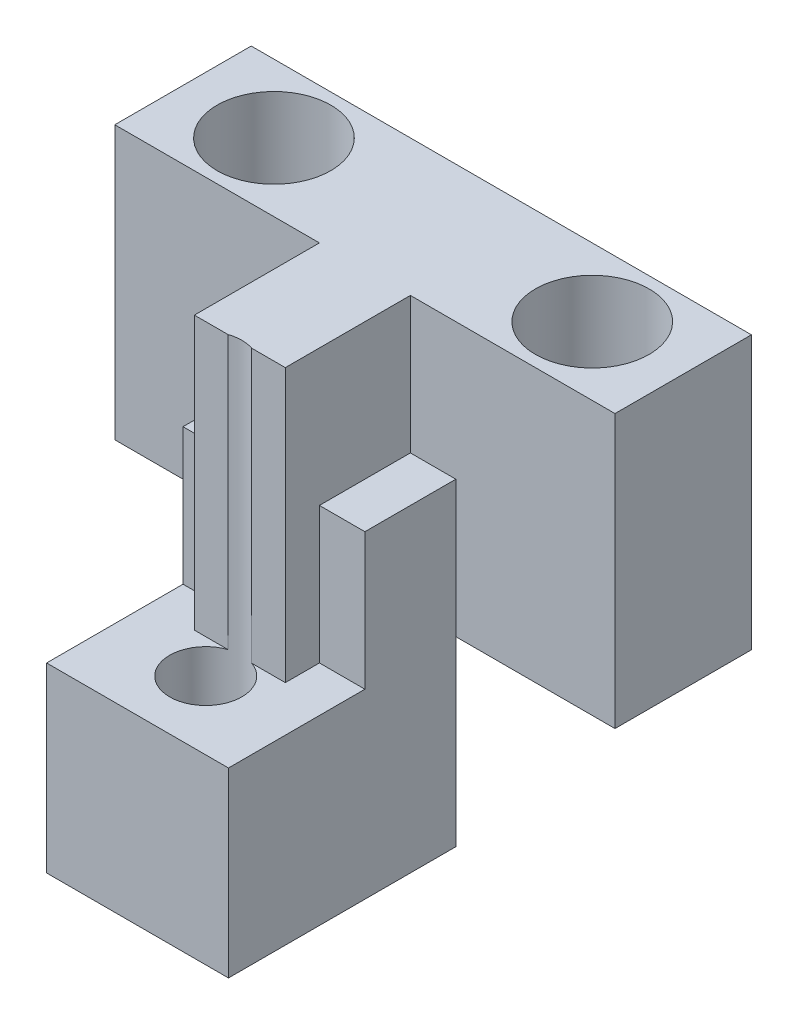
ISO-10303-21;
HEADER;
FILE_DESCRIPTION(('STEP AP214'),'2;1');
FILE_NAME('part.step','',(''),(''),'','','');
FILE_SCHEMA(('AUTOMOTIVE_DESIGN { 1 0 10303 214 1 1 1 1 }'));
ENDSEC;
DATA;
#1=APPLICATION_CONTEXT('core data for automotive mechanical design processes');
#2=APPLICATION_PROTOCOL_DEFINITION('international standard','automotive_design',2000,#1);
#3=PRODUCT_CONTEXT('',#1,'mechanical');
#4=PRODUCT('Part','Part','',(#3));
#5=PRODUCT_RELATED_PRODUCT_CATEGORY('part','',(#4));
#6=PRODUCT_DEFINITION_FORMATION('','',#4);
#7=PRODUCT_DEFINITION_CONTEXT('part definition',#1,'design');
#8=PRODUCT_DEFINITION('design','',#6,#7);
#9=PRODUCT_DEFINITION_SHAPE('','',#8);
#10=(LENGTH_UNIT() NAMED_UNIT(*) SI_UNIT(.MILLI.,.METRE.));
#11=(NAMED_UNIT(*) PLANE_ANGLE_UNIT() SI_UNIT($,.RADIAN.));
#12=(NAMED_UNIT(*) SI_UNIT($,.STERADIAN.) SOLID_ANGLE_UNIT());
#13=UNCERTAINTY_MEASURE_WITH_UNIT(LENGTH_MEASURE(1.E-05),#10,'distance_accuracy_value','');
#14=(GEOMETRIC_REPRESENTATION_CONTEXT(3) GLOBAL_UNCERTAINTY_ASSIGNED_CONTEXT((#13)) GLOBAL_UNIT_ASSIGNED_CONTEXT((#10,
#11,#12)) REPRESENTATION_CONTEXT('',''));
#15=CARTESIAN_POINT('',(0.,0.,0.));
#16=DIRECTION('',(0.,0.,1.));
#17=DIRECTION('',(1.,0.,0.));
#18=AXIS2_PLACEMENT_3D('',#15,#16,#17);
#19=CARTESIAN_POINT('',(-22.,12.,12.));
#20=DIRECTION('',(0.,-1.,0.));
#21=DIRECTION('',(0.,0.,-1.));
#22=AXIS2_PLACEMENT_3D('',#19,#20,#21);
#23=PLANE('',#22);
#24=CARTESIAN_POINT('',(14.,12.,6.));
#25=DIRECTION('',(0.,1.,0.));
#26=DIRECTION('',(0.,0.,1.));
#27=AXIS2_PLACEMENT_3D('',#24,#25,#26);
#28=CIRCLE('',#27,5.);
#29=CARTESIAN_POINT('',(14.,12.,11.));
#30=VERTEX_POINT('',#29);
#31=EDGE_CURVE('E335',#30,#30,#28,.T.);
#32=ORIENTED_EDGE('',*,*,#31,.F.);
#33=EDGE_LOOP('',(#32));
#34=FACE_BOUND('',#33,.T.);
#35=CARTESIAN_POINT('',(-14.,12.,6.));
#36=DIRECTION('',(0.,1.,0.));
#37=DIRECTION('',(0.,0.,1.));
#38=AXIS2_PLACEMENT_3D('',#35,#36,#37);
#39=CIRCLE('',#38,5.);
#40=CARTESIAN_POINT('',(-14.,12.,11.));
#41=VERTEX_POINT('',#40);
#42=EDGE_CURVE('E333',#41,#41,#39,.T.);
#43=ORIENTED_EDGE('',*,*,#42,.F.);
#44=EDGE_LOOP('',(#43));
#45=FACE_BOUND('',#44,.T.);
#46=CARTESIAN_POINT('',(0.,12.,26.));
#47=DIRECTION('',(0.,1.,0.));
#48=DIRECTION('',(0.,0.,1.));
#49=AXIS2_PLACEMENT_3D('',#46,#47,#48);
#50=CIRCLE('',#49,3.175);
#51=CARTESIAN_POINT('',(1.03953114431459,12.,23.));
#52=VERTEX_POINT('',#51);
#53=CARTESIAN_POINT('',(-1.03953114431459,12.,23.));
#54=VERTEX_POINT('',#53);
#55=EDGE_CURVE('E174',#52,#54,#50,.T.);
#56=ORIENTED_EDGE('',*,*,#55,.F.);
#57=DIRECTION('',(-1.,0.,0.));
#58=VECTOR('',#57,1.);
#59=CARTESIAN_POINT('',(-4.,12.,23.));
#60=LINE('',#59,#58);
#61=CARTESIAN_POINT('',(4.,12.,23.));
#62=VERTEX_POINT('',#61);
#63=EDGE_CURVE('E182',#62,#52,#60,.T.);
#64=ORIENTED_EDGE('',*,*,#63,.F.);
#65=DIRECTION('',(0.,0.,-1.));
#66=VECTOR('',#65,1.);
#67=CARTESIAN_POINT('',(4.,12.,23.));
#68=LINE('',#67,#66);
#69=CARTESIAN_POINT('',(4.,12.,12.));
#70=VERTEX_POINT('',#69);
#71=EDGE_CURVE('E195',#62,#70,#68,.T.);
#72=ORIENTED_EDGE('',*,*,#71,.T.);
#73=DIRECTION('',(-1.,0.,0.));
#74=VECTOR('',#73,1.);
#75=CARTESIAN_POINT('',(-22.,12.,12.));
#76=LINE('',#75,#74);
#77=CARTESIAN_POINT('',(22.,12.,12.));
#78=VERTEX_POINT('',#77);
#79=EDGE_CURVE('E225',#78,#70,#76,.T.);
#80=ORIENTED_EDGE('',*,*,#79,.F.);
#81=DIRECTION('',(0.,0.,-1.));
#82=VECTOR('',#81,1.);
#83=CARTESIAN_POINT('',(22.,12.,12.));
#84=LINE('',#83,#82);
#85=CARTESIAN_POINT('',(22.,12.,0.));
#86=VERTEX_POINT('',#85);
#87=EDGE_CURVE('E233',#78,#86,#84,.T.);
#88=ORIENTED_EDGE('',*,*,#87,.T.);
#89=DIRECTION('',(-1.,0.,0.));
#90=VECTOR('',#89,1.);
#91=CARTESIAN_POINT('',(-22.,12.,0.));
#92=LINE('',#91,#90);
#93=CARTESIAN_POINT('',(-22.,12.,0.));
#94=VERTEX_POINT('',#93);
#95=EDGE_CURVE('E214',#86,#94,#92,.T.);
#96=ORIENTED_EDGE('',*,*,#95,.T.);
#97=DIRECTION('',(0.,0.,-1.));
#98=VECTOR('',#97,1.);
#99=CARTESIAN_POINT('',(-22.,12.,12.));
#100=LINE('',#99,#98);
#101=CARTESIAN_POINT('',(-22.,12.,12.));
#102=VERTEX_POINT('',#101);
#103=EDGE_CURVE('E223',#102,#94,#100,.T.);
#104=ORIENTED_EDGE('',*,*,#103,.F.);
#105=CARTESIAN_POINT('',(-4.,12.,12.));
#106=VERTEX_POINT('',#105);
#107=EDGE_CURVE('E222',#106,#102,#76,.T.);
#108=ORIENTED_EDGE('',*,*,#107,.F.);
#109=DIRECTION('',(0.,0.,-1.));
#110=VECTOR('',#109,1.);
#111=CARTESIAN_POINT('',(-4.,12.,23.));
#112=LINE('',#111,#110);
#113=CARTESIAN_POINT('',(-4.,12.,23.));
#114=VERTEX_POINT('',#113);
#115=EDGE_CURVE('E188',#114,#106,#112,.T.);
#116=ORIENTED_EDGE('',*,*,#115,.F.);
#117=EDGE_CURVE('E181',#54,#114,#60,.T.);
#118=ORIENTED_EDGE('',*,*,#117,.F.);
#119=EDGE_LOOP('',(#56,#64,#72,#80,#88,#96,#104,#108,#116,#118));
#120=FACE_BOUND('',#119,.T.);
#121=ADVANCED_FACE('F39',(#34,#45,#120),#23,.F.);
#122=CARTESIAN_POINT('',(0.,0.,23.));
#123=DIRECTION('',(0.,0.,-1.));
#124=DIRECTION('',(-1.,0.,0.));
#125=AXIS2_PLACEMENT_3D('',#122,#123,#124);
#126=PLANE('',#125);
#127=DIRECTION('',(1.,0.,0.));
#128=VECTOR('',#127,1.);
#129=CARTESIAN_POINT('',(-4.,-12.,23.));
#130=LINE('',#129,#128);
#131=CARTESIAN_POINT('',(-4.,-12.,23.));
#132=VERTEX_POINT('',#131);
#133=CARTESIAN_POINT('',(-1.03953114431459,-12.,23.));
#134=VERTEX_POINT('',#133);
#135=EDGE_CURVE('E296',#132,#134,#130,.T.);
#136=ORIENTED_EDGE('',*,*,#135,.T.);
#137=DIRECTION('',(0.,1.,0.));
#138=VECTOR('',#137,1.);
#139=CARTESIAN_POINT('',(-1.03953114431459,-28.,23.));
#140=LINE('',#139,#138);
#141=EDGE_CURVE('E53',#134,#54,#140,.T.);
#142=ORIENTED_EDGE('',*,*,#141,.T.);
#143=ORIENTED_EDGE('',*,*,#117,.T.);
#144=DIRECTION('',(0.,-1.,0.));
#145=VECTOR('',#144,1.);
#146=CARTESIAN_POINT('',(-4.,-12.,23.));
#147=LINE('',#146,#145);
#148=EDGE_CURVE('E205',#114,#132,#147,.T.);
#149=ORIENTED_EDGE('',*,*,#148,.T.);
#150=EDGE_LOOP('',(#136,#142,#143,#149));
#151=FACE_BOUND('',#150,.T.);
#152=ADVANCED_FACE('F332',(#151),#126,.F.);
#153=CARTESIAN_POINT('',(0.,0.,20.));
#154=DIRECTION('',(0.,0.,-1.));
#155=DIRECTION('',(-1.,0.,0.));
#156=AXIS2_PLACEMENT_3D('',#153,#154,#155);
#157=PLANE('',#156);
#158=DIRECTION('',(-1.,0.,0.));
#159=VECTOR('',#158,1.);
#160=CARTESIAN_POINT('',(-8.,-12.,20.));
#161=LINE('',#160,#159);
#162=CARTESIAN_POINT('',(8.,-12.,20.));
#163=VERTEX_POINT('',#162);
#164=CARTESIAN_POINT('',(4.,-12.,20.));
#165=VERTEX_POINT('',#164);
#166=EDGE_CURVE('E304',#163,#165,#161,.T.);
#167=ORIENTED_EDGE('',*,*,#166,.F.);
#168=DIRECTION('',(0.,1.,0.));
#169=VECTOR('',#168,1.);
#170=CARTESIAN_POINT('',(8.,-28.,20.));
#171=LINE('',#170,#169);
#172=CARTESIAN_POINT('',(8.,0.,20.));
#173=VERTEX_POINT('',#172);
#174=EDGE_CURVE('E261',#163,#173,#171,.T.);
#175=ORIENTED_EDGE('',*,*,#174,.T.);
#176=DIRECTION('',(-1.,0.,0.));
#177=VECTOR('',#176,1.);
#178=CARTESIAN_POINT('',(-8.,0.,20.));
#179=LINE('',#178,#177);
#180=CARTESIAN_POINT('',(4.,0.,20.));
#181=VERTEX_POINT('',#180);
#182=EDGE_CURVE('E251',#173,#181,#179,.T.);
#183=ORIENTED_EDGE('',*,*,#182,.T.);
#184=DIRECTION('',(0.,-1.,0.));
#185=VECTOR('',#184,1.);
#186=CARTESIAN_POINT('',(4.,-12.,20.));
#187=LINE('',#186,#185);
#188=EDGE_CURVE('E243',#181,#165,#187,.T.);
#189=ORIENTED_EDGE('',*,*,#188,.T.);
#190=EDGE_LOOP('',(#167,#175,#183,#189));
#191=FACE_BOUND('',#190,.T.);
#192=ADVANCED_FACE('F259',(#191),#157,.F.);
#193=CARTESIAN_POINT('',(-4.,-12.,20.));
#194=VERTEX_POINT('',#193);
#195=CARTESIAN_POINT('',(-8.,-12.,20.));
#196=VERTEX_POINT('',#195);
#197=EDGE_CURVE('E350',#194,#196,#161,.T.);
#198=ORIENTED_EDGE('',*,*,#197,.F.);
#199=DIRECTION('',(0.,1.,0.));
#200=VECTOR('',#199,1.);
#201=CARTESIAN_POINT('',(-4.,-12.,20.));
#202=LINE('',#201,#200);
#203=CARTESIAN_POINT('',(-4.,0.,20.));
#204=VERTEX_POINT('',#203);
#205=EDGE_CURVE('E288',#194,#204,#202,.T.);
#206=ORIENTED_EDGE('',*,*,#205,.T.);
#207=CARTESIAN_POINT('',(-8.,0.,20.));
#208=VERTEX_POINT('',#207);
#209=EDGE_CURVE('E262',#204,#208,#179,.T.);
#210=ORIENTED_EDGE('',*,*,#209,.T.);
#211=DIRECTION('',(0.,-1.,0.));
#212=VECTOR('',#211,1.);
#213=CARTESIAN_POINT('',(-8.,-28.,20.));
#214=LINE('',#213,#212);
#215=EDGE_CURVE('E284',#208,#196,#214,.T.);
#216=ORIENTED_EDGE('',*,*,#215,.T.);
#217=EDGE_LOOP('',(#198,#206,#210,#216));
#218=FACE_BOUND('',#217,.T.);
#219=ADVANCED_FACE('F370',(#218),#157,.F.);
#220=CARTESIAN_POINT('',(0.,0.,12.));
#221=DIRECTION('',(0.,0.,-1.));
#222=DIRECTION('',(-1.,0.,0.));
#223=AXIS2_PLACEMENT_3D('',#220,#221,#222);
#224=PLANE('',#223);
#225=DIRECTION('',(0.,-1.,0.));
#226=VECTOR('',#225,1.);
#227=CARTESIAN_POINT('',(-8.,-28.,12.));
#228=LINE('',#227,#226);
#229=CARTESIAN_POINT('',(-8.,0.,12.));
#230=VERTEX_POINT('',#229);
#231=CARTESIAN_POINT('',(-8.,-12.,12.));
#232=VERTEX_POINT('',#231);
#233=EDGE_CURVE('E64',#230,#232,#228,.T.);
#234=ORIENTED_EDGE('',*,*,#233,.F.);
#235=DIRECTION('',(-1.,0.,0.));
#236=VECTOR('',#235,1.);
#237=CARTESIAN_POINT('',(-8.,0.,12.));
#238=LINE('',#237,#236);
#239=CARTESIAN_POINT('',(-4.,0.,12.));
#240=VERTEX_POINT('',#239);
#241=EDGE_CURVE('E278',#240,#230,#238,.T.);
#242=ORIENTED_EDGE('',*,*,#241,.F.);
#243=DIRECTION('',(0.,-1.,0.));
#244=VECTOR('',#243,1.);
#245=CARTESIAN_POINT('',(-4.,-12.,12.));
#246=LINE('',#245,#244);
#247=EDGE_CURVE('E197',#106,#240,#246,.T.);
#248=ORIENTED_EDGE('',*,*,#247,.F.);
#249=ORIENTED_EDGE('',*,*,#107,.T.);
#250=DIRECTION('',(0.,-1.,0.));
#251=VECTOR('',#250,1.);
#252=CARTESIAN_POINT('',(-22.,-12.,12.));
#253=LINE('',#252,#251);
#254=CARTESIAN_POINT('',(-22.,-12.,12.));
#255=VERTEX_POINT('',#254);
#256=EDGE_CURVE('E211',#102,#255,#253,.T.);
#257=ORIENTED_EDGE('',*,*,#256,.T.);
#258=DIRECTION('',(1.,0.,0.));
#259=VECTOR('',#258,1.);
#260=CARTESIAN_POINT('',(-22.,-12.,12.));
#261=LINE('',#260,#259);
#262=EDGE_CURVE('E216',#255,#232,#261,.T.);
#263=ORIENTED_EDGE('',*,*,#262,.T.);
#264=EDGE_LOOP('',(#234,#242,#248,#249,#257,#263));
#265=FACE_BOUND('',#264,.T.);
#266=ADVANCED_FACE('F322',(#265),#224,.F.);
#267=CARTESIAN_POINT('',(8.,0.,12.));
#268=VERTEX_POINT('',#267);
#269=CARTESIAN_POINT('',(4.,0.,12.));
#270=VERTEX_POINT('',#269);
#271=EDGE_CURVE('E255',#268,#270,#238,.T.);
#272=ORIENTED_EDGE('',*,*,#271,.F.);
#273=DIRECTION('',(0.,1.,0.));
#274=VECTOR('',#273,1.);
#275=CARTESIAN_POINT('',(8.,-28.,12.));
#276=LINE('',#275,#274);
#277=CARTESIAN_POINT('',(8.,-12.,12.));
#278=VERTEX_POINT('',#277);
#279=EDGE_CURVE('E277',#278,#268,#276,.T.);
#280=ORIENTED_EDGE('',*,*,#279,.F.);
#281=CARTESIAN_POINT('',(22.,-12.,12.));
#282=VERTEX_POINT('',#281);
#283=EDGE_CURVE('E212',#278,#282,#261,.T.);
#284=ORIENTED_EDGE('',*,*,#283,.T.);
#285=DIRECTION('',(0.,1.,0.));
#286=VECTOR('',#285,1.);
#287=CARTESIAN_POINT('',(22.,-12.,12.));
#288=LINE('',#287,#286);
#289=EDGE_CURVE('E217',#282,#78,#288,.T.);
#290=ORIENTED_EDGE('',*,*,#289,.T.);
#291=ORIENTED_EDGE('',*,*,#79,.T.);
#292=DIRECTION('',(0.,1.,0.));
#293=VECTOR('',#292,1.);
#294=CARTESIAN_POINT('',(4.,-12.,12.));
#295=LINE('',#294,#293);
#296=EDGE_CURVE('E199',#270,#70,#295,.T.);
#297=ORIENTED_EDGE('',*,*,#296,.F.);
#298=EDGE_LOOP('',(#272,#280,#284,#290,#291,#297));
#299=FACE_BOUND('',#298,.T.);
#300=ADVANCED_FACE('F310',(#299),#224,.F.);
#301=CARTESIAN_POINT('',(-4.,-12.,23.));
#302=DIRECTION('',(1.,0.,0.));
#303=DIRECTION('',(0.,0.,-1.));
#304=AXIS2_PLACEMENT_3D('',#301,#302,#303);
#305=PLANE('',#304);
#306=DIRECTION('',(0.,0.,-1.));
#307=VECTOR('',#306,1.);
#308=CARTESIAN_POINT('',(-4.,0.,23.));
#309=LINE('',#308,#307);
#310=EDGE_CURVE('E203',#204,#240,#309,.T.);
#311=ORIENTED_EDGE('',*,*,#310,.F.);
#312=ORIENTED_EDGE('',*,*,#205,.F.);
#313=DIRECTION('',(0.,0.,-1.));
#314=VECTOR('',#313,1.);
#315=CARTESIAN_POINT('',(-4.,-12.,23.));
#316=LINE('',#315,#314);
#317=EDGE_CURVE('E208',#132,#194,#316,.T.);
#318=ORIENTED_EDGE('',*,*,#317,.F.);
#319=ORIENTED_EDGE('',*,*,#148,.F.);
#320=ORIENTED_EDGE('',*,*,#115,.T.);
#321=ORIENTED_EDGE('',*,*,#247,.T.);
#322=EDGE_LOOP('',(#311,#312,#318,#319,#320,#321));
#323=FACE_BOUND('',#322,.T.);
#324=ADVANCED_FACE('F327',(#323),#305,.F.);
#325=CARTESIAN_POINT('',(4.,-12.,23.));
#326=DIRECTION('',(-1.,0.,0.));
#327=DIRECTION('',(0.,0.,1.));
#328=AXIS2_PLACEMENT_3D('',#325,#326,#327);
#329=PLANE('',#328);
#330=DIRECTION('',(0.,0.,1.));
#331=VECTOR('',#330,1.);
#332=CARTESIAN_POINT('',(4.,0.,23.));
#333=LINE('',#332,#331);
#334=EDGE_CURVE('E50',#270,#181,#333,.T.);
#335=ORIENTED_EDGE('',*,*,#334,.F.);
#336=ORIENTED_EDGE('',*,*,#296,.T.);
#337=ORIENTED_EDGE('',*,*,#71,.F.);
#338=DIRECTION('',(0.,1.,0.));
#339=VECTOR('',#338,1.);
#340=CARTESIAN_POINT('',(4.,-12.,23.));
#341=LINE('',#340,#339);
#342=CARTESIAN_POINT('',(4.,-12.,23.));
#343=VERTEX_POINT('',#342);
#344=EDGE_CURVE('E186',#343,#62,#341,.T.);
#345=ORIENTED_EDGE('',*,*,#344,.F.);
#346=DIRECTION('',(0.,0.,-1.));
#347=VECTOR('',#346,1.);
#348=CARTESIAN_POINT('',(4.,-12.,23.));
#349=LINE('',#348,#347);
#350=EDGE_CURVE('E202',#343,#165,#349,.T.);
#351=ORIENTED_EDGE('',*,*,#350,.T.);
#352=ORIENTED_EDGE('',*,*,#188,.F.);
#353=EDGE_LOOP('',(#335,#336,#337,#345,#351,#352));
#354=FACE_BOUND('',#353,.T.);
#355=ADVANCED_FACE('F301',(#354),#329,.F.);
#356=CARTESIAN_POINT('',(-22.,-12.,12.));
#357=DIRECTION('',(1.,0.,0.));
#358=DIRECTION('',(0.,0.,-1.));
#359=AXIS2_PLACEMENT_3D('',#356,#357,#358);
#360=PLANE('',#359);
#361=DIRECTION('',(0.,-1.,0.));
#362=VECTOR('',#361,1.);
#363=CARTESIAN_POINT('',(-22.,-12.,0.));
#364=LINE('',#363,#362);
#365=CARTESIAN_POINT('',(-22.,-12.,0.));
#366=VERTEX_POINT('',#365);
#367=EDGE_CURVE('E209',#94,#366,#364,.T.);
#368=ORIENTED_EDGE('',*,*,#367,.T.);
#369=DIRECTION('',(0.,0.,-1.));
#370=VECTOR('',#369,1.);
#371=CARTESIAN_POINT('',(-22.,-12.,12.));
#372=LINE('',#371,#370);
#373=EDGE_CURVE('E244',#255,#366,#372,.T.);
#374=ORIENTED_EDGE('',*,*,#373,.F.);
#375=ORIENTED_EDGE('',*,*,#256,.F.);
#376=ORIENTED_EDGE('',*,*,#103,.T.);
#377=EDGE_LOOP('',(#368,#374,#375,#376));
#378=FACE_BOUND('',#377,.T.);
#379=ADVANCED_FACE('F41',(#378),#360,.F.);
#380=CARTESIAN_POINT('',(-22.,-12.,12.));
#381=DIRECTION('',(0.,1.,0.));
#382=DIRECTION('',(0.,0.,1.));
#383=AXIS2_PLACEMENT_3D('',#380,#381,#382);
#384=PLANE('',#383);
#385=CARTESIAN_POINT('',(-14.,-12.,6.));
#386=DIRECTION('',(0.,1.,0.));
#387=DIRECTION('',(0.,0.,1.));
#388=AXIS2_PLACEMENT_3D('',#385,#386,#387);
#389=CIRCLE('',#388,5.);
#390=CARTESIAN_POINT('',(-14.,-12.,11.));
#391=VERTEX_POINT('',#390);
#392=EDGE_CURVE('E341',#391,#391,#389,.T.);
#393=ORIENTED_EDGE('',*,*,#392,.T.);
#394=EDGE_LOOP('',(#393));
#395=FACE_BOUND('',#394,.T.);
#396=CARTESIAN_POINT('',(14.,-12.,6.));
#397=DIRECTION('',(0.,1.,0.));
#398=DIRECTION('',(0.,0.,1.));
#399=AXIS2_PLACEMENT_3D('',#396,#397,#398);
#400=CIRCLE('',#399,5.);
#401=CARTESIAN_POINT('',(14.,-12.,11.));
#402=VERTEX_POINT('',#401);
#403=EDGE_CURVE('E337',#402,#402,#400,.T.);
#404=ORIENTED_EDGE('',*,*,#403,.T.);
#405=EDGE_LOOP('',(#404));
#406=FACE_BOUND('',#405,.T.);
#407=EDGE_CURVE('E218',#232,#278,#261,.T.);
#408=ORIENTED_EDGE('',*,*,#407,.F.);
#409=ORIENTED_EDGE('',*,*,#262,.F.);
#410=ORIENTED_EDGE('',*,*,#373,.T.);
#411=DIRECTION('',(1.,0.,0.));
#412=VECTOR('',#411,1.);
#413=CARTESIAN_POINT('',(-22.,-12.,0.));
#414=LINE('',#413,#412);
#415=CARTESIAN_POINT('',(22.,-12.,0.));
#416=VERTEX_POINT('',#415);
#417=EDGE_CURVE('E230',#366,#416,#414,.T.);
#418=ORIENTED_EDGE('',*,*,#417,.T.);
#419=DIRECTION('',(0.,0.,-1.));
#420=VECTOR('',#419,1.);
#421=CARTESIAN_POINT('',(22.,-12.,12.));
#422=LINE('',#421,#420);
#423=EDGE_CURVE('E236',#282,#416,#422,.T.);
#424=ORIENTED_EDGE('',*,*,#423,.F.);
#425=ORIENTED_EDGE('',*,*,#283,.F.);
#426=EDGE_LOOP('',(#408,#409,#410,#418,#424,#425));
#427=FACE_BOUND('',#426,.T.);
#428=ADVANCED_FACE('F387',(#395,#406,#427),#384,.F.);
#429=CARTESIAN_POINT('',(22.,-12.,12.));
#430=DIRECTION('',(-1.,0.,0.));
#431=DIRECTION('',(0.,0.,1.));
#432=AXIS2_PLACEMENT_3D('',#429,#430,#431);
#433=PLANE('',#432);
#434=DIRECTION('',(0.,1.,0.));
#435=VECTOR('',#434,1.);
#436=CARTESIAN_POINT('',(22.,-12.,0.));
#437=LINE('',#436,#435);
#438=EDGE_CURVE('E227',#416,#86,#437,.T.);
#439=ORIENTED_EDGE('',*,*,#438,.T.);
#440=ORIENTED_EDGE('',*,*,#87,.F.);
#441=ORIENTED_EDGE('',*,*,#289,.F.);
#442=ORIENTED_EDGE('',*,*,#423,.T.);
#443=EDGE_LOOP('',(#439,#440,#441,#442));
#444=FACE_BOUND('',#443,.T.);
#445=ADVANCED_FACE('F314',(#444),#433,.F.);
#446=CARTESIAN_POINT('',(0.,0.,0.));
#447=DIRECTION('',(0.,0.,-1.));
#448=DIRECTION('',(-1.,0.,0.));
#449=AXIS2_PLACEMENT_3D('',#446,#447,#448);
#450=PLANE('',#449);
#451=ORIENTED_EDGE('',*,*,#367,.F.);
#452=ORIENTED_EDGE('',*,*,#95,.F.);
#453=ORIENTED_EDGE('',*,*,#438,.F.);
#454=ORIENTED_EDGE('',*,*,#417,.F.);
#455=EDGE_LOOP('',(#451,#452,#453,#454));
#456=FACE_BOUND('',#455,.T.);
#457=ADVANCED_FACE('F318',(#456),#450,.T.);
#458=ORIENTED_EDGE('',*,*,#63,.T.);
#459=DIRECTION('',(0.,1.,0.));
#460=VECTOR('',#459,1.);
#461=CARTESIAN_POINT('',(1.03953114431459,-28.,23.));
#462=LINE('',#461,#460);
#463=CARTESIAN_POINT('',(1.03953114431459,-12.,23.));
#464=VERTEX_POINT('',#463);
#465=EDGE_CURVE('E169',#52,#464,#462,.F.);
#466=ORIENTED_EDGE('',*,*,#465,.T.);
#467=EDGE_CURVE('E299',#464,#343,#130,.T.);
#468=ORIENTED_EDGE('',*,*,#467,.T.);
#469=ORIENTED_EDGE('',*,*,#344,.T.);
#470=EDGE_LOOP('',(#458,#466,#468,#469));
#471=FACE_BOUND('',#470,.T.);
#472=ADVANCED_FACE('F183',(#471),#126,.F.);
#473=CARTESIAN_POINT('',(0.,0.,12.));
#474=DIRECTION('',(0.,0.,-1.));
#475=DIRECTION('',(-1.,0.,0.));
#476=AXIS2_PLACEMENT_3D('',#473,#474,#475);
#477=PLANE('',#476);
#478=ORIENTED_EDGE('',*,*,#407,.T.);
#479=CARTESIAN_POINT('',(8.,-28.,12.));
#480=VERTEX_POINT('',#479);
#481=EDGE_CURVE('E280',#480,#278,#276,.T.);
#482=ORIENTED_EDGE('',*,*,#481,.F.);
#483=DIRECTION('',(1.,0.,0.));
#484=VECTOR('',#483,1.);
#485=CARTESIAN_POINT('',(-8.,-28.,12.));
#486=LINE('',#485,#484);
#487=CARTESIAN_POINT('',(-8.,-28.,12.));
#488=VERTEX_POINT('',#487);
#489=EDGE_CURVE('E272',#488,#480,#486,.T.);
#490=ORIENTED_EDGE('',*,*,#489,.F.);
#491=EDGE_CURVE('E273',#232,#488,#228,.T.);
#492=ORIENTED_EDGE('',*,*,#491,.F.);
#493=EDGE_LOOP('',(#478,#482,#490,#492));
#494=FACE_BOUND('',#493,.T.);
#495=ADVANCED_FACE('F389',(#494),#477,.T.);
#496=CARTESIAN_POINT('',(-8.,0.,20.));
#497=DIRECTION('',(0.,-1.,0.));
#498=DIRECTION('',(0.,0.,-1.));
#499=AXIS2_PLACEMENT_3D('',#496,#497,#498);
#500=PLANE('',#499);
#501=ORIENTED_EDGE('',*,*,#209,.F.);
#502=ORIENTED_EDGE('',*,*,#310,.T.);
#503=ORIENTED_EDGE('',*,*,#241,.T.);
#504=DIRECTION('',(0.,0.,-1.));
#505=VECTOR('',#504,1.);
#506=CARTESIAN_POINT('',(-8.,0.,20.));
#507=LINE('',#506,#505);
#508=EDGE_CURVE('E263',#208,#230,#507,.T.);
#509=ORIENTED_EDGE('',*,*,#508,.F.);
#510=EDGE_LOOP('',(#501,#502,#503,#509));
#511=FACE_BOUND('',#510,.T.);
#512=ADVANCED_FACE('F443',(#511),#500,.F.);
#513=ORIENTED_EDGE('',*,*,#271,.T.);
#514=ORIENTED_EDGE('',*,*,#334,.T.);
#515=ORIENTED_EDGE('',*,*,#182,.F.);
#516=DIRECTION('',(0.,0.,-1.));
#517=VECTOR('',#516,1.);
#518=CARTESIAN_POINT('',(8.,0.,20.));
#519=LINE('',#518,#517);
#520=EDGE_CURVE('E270',#173,#268,#519,.T.);
#521=ORIENTED_EDGE('',*,*,#520,.T.);
#522=EDGE_LOOP('',(#513,#514,#515,#521));
#523=FACE_BOUND('',#522,.T.);
#524=ADVANCED_FACE('F253',(#523),#500,.F.);
#525=CARTESIAN_POINT('',(-8.,-28.,20.));
#526=DIRECTION('',(1.,0.,0.));
#527=DIRECTION('',(0.,0.,-1.));
#528=AXIS2_PLACEMENT_3D('',#525,#526,#527);
#529=PLANE('',#528);
#530=ORIENTED_EDGE('',*,*,#233,.T.);
#531=ORIENTED_EDGE('',*,*,#491,.T.);
#532=DIRECTION('',(0.,0.,-1.));
#533=VECTOR('',#532,1.);
#534=CARTESIAN_POINT('',(-8.,-28.,20.));
#535=LINE('',#534,#533);
#536=CARTESIAN_POINT('',(-8.,-28.,32.));
#537=VERTEX_POINT('',#536);
#538=EDGE_CURVE('E290',#537,#488,#535,.T.);
#539=ORIENTED_EDGE('',*,*,#538,.F.);
#540=DIRECTION('',(0.,-1.,0.));
#541=VECTOR('',#540,1.);
#542=CARTESIAN_POINT('',(-8.,-28.,32.));
#543=LINE('',#542,#541);
#544=CARTESIAN_POINT('',(-8.,-12.,32.));
#545=VERTEX_POINT('',#544);
#546=EDGE_CURVE('E346',#545,#537,#543,.T.);
#547=ORIENTED_EDGE('',*,*,#546,.F.);
#548=DIRECTION('',(0.,0.,-1.));
#549=VECTOR('',#548,1.);
#550=CARTESIAN_POINT('',(-8.,-12.,32.));
#551=LINE('',#550,#549);
#552=EDGE_CURVE('E359',#545,#196,#551,.T.);
#553=ORIENTED_EDGE('',*,*,#552,.T.);
#554=ORIENTED_EDGE('',*,*,#215,.F.);
#555=ORIENTED_EDGE('',*,*,#508,.T.);
#556=EDGE_LOOP('',(#530,#531,#539,#547,#553,#554,#555));
#557=FACE_BOUND('',#556,.T.);
#558=ADVANCED_FACE('F371',(#557),#529,.F.);
#559=CARTESIAN_POINT('',(-8.,-28.,20.));
#560=DIRECTION('',(0.,1.,0.));
#561=DIRECTION('',(0.,0.,1.));
#562=AXIS2_PLACEMENT_3D('',#559,#560,#561);
#563=PLANE('',#562);
#564=CARTESIAN_POINT('',(0.,-28.,26.));
#565=DIRECTION('',(0.,1.,0.));
#566=DIRECTION('',(0.,0.,1.));
#567=AXIS2_PLACEMENT_3D('',#564,#565,#566);
#568=CIRCLE('',#567,3.175);
#569=CARTESIAN_POINT('',(0.,-28.,29.175));
#570=VERTEX_POINT('',#569);
#571=EDGE_CURVE('E172',#570,#570,#568,.T.);
#572=ORIENTED_EDGE('',*,*,#571,.T.);
#573=EDGE_LOOP('',(#572));
#574=FACE_BOUND('',#573,.T.);
#575=ORIENTED_EDGE('',*,*,#489,.T.);
#576=DIRECTION('',(0.,0.,-1.));
#577=VECTOR('',#576,1.);
#578=CARTESIAN_POINT('',(8.,-28.,20.));
#579=LINE('',#578,#577);
#580=CARTESIAN_POINT('',(8.,-28.,32.));
#581=VERTEX_POINT('',#580);
#582=EDGE_CURVE('E283',#581,#480,#579,.T.);
#583=ORIENTED_EDGE('',*,*,#582,.F.);
#584=DIRECTION('',(1.,0.,0.));
#585=VECTOR('',#584,1.);
#586=CARTESIAN_POINT('',(-8.,-28.,32.));
#587=LINE('',#586,#585);
#588=EDGE_CURVE('E354',#537,#581,#587,.T.);
#589=ORIENTED_EDGE('',*,*,#588,.F.);
#590=ORIENTED_EDGE('',*,*,#538,.T.);
#591=EDGE_LOOP('',(#575,#583,#589,#590));
#592=FACE_BOUND('',#591,.T.);
#593=ADVANCED_FACE('F394',(#574,#592),#563,.F.);
#594=CARTESIAN_POINT('',(8.,-28.,20.));
#595=DIRECTION('',(-1.,0.,0.));
#596=DIRECTION('',(0.,0.,1.));
#597=AXIS2_PLACEMENT_3D('',#594,#595,#596);
#598=PLANE('',#597);
#599=ORIENTED_EDGE('',*,*,#481,.T.);
#600=ORIENTED_EDGE('',*,*,#279,.T.);
#601=ORIENTED_EDGE('',*,*,#520,.F.);
#602=ORIENTED_EDGE('',*,*,#174,.F.);
#603=DIRECTION('',(0.,0.,-1.));
#604=VECTOR('',#603,1.);
#605=CARTESIAN_POINT('',(8.,-12.,32.));
#606=LINE('',#605,#604);
#607=CARTESIAN_POINT('',(8.,-12.,32.));
#608=VERTEX_POINT('',#607);
#609=EDGE_CURVE('E362',#608,#163,#606,.T.);
#610=ORIENTED_EDGE('',*,*,#609,.F.);
#611=DIRECTION('',(0.,1.,0.));
#612=VECTOR('',#611,1.);
#613=CARTESIAN_POINT('',(8.,-28.,32.));
#614=LINE('',#613,#612);
#615=EDGE_CURVE('E353',#581,#608,#614,.T.);
#616=ORIENTED_EDGE('',*,*,#615,.F.);
#617=ORIENTED_EDGE('',*,*,#582,.T.);
#618=EDGE_LOOP('',(#599,#600,#601,#602,#610,#616,#617));
#619=FACE_BOUND('',#618,.T.);
#620=ADVANCED_FACE('F381',(#619),#598,.F.);
#621=CARTESIAN_POINT('',(-8.,-12.,32.));
#622=DIRECTION('',(0.,-1.,0.));
#623=DIRECTION('',(0.,0.,-1.));
#624=AXIS2_PLACEMENT_3D('',#621,#622,#623);
#625=PLANE('',#624);
#626=ORIENTED_EDGE('',*,*,#467,.F.);
#627=CARTESIAN_POINT('',(0.,-12.,26.));
#628=DIRECTION('',(0.,-1.,0.));
#629=DIRECTION('',(0.,0.,-1.));
#630=AXIS2_PLACEMENT_3D('',#627,#628,#629);
#631=CIRCLE('',#630,3.175);
#632=EDGE_CURVE('E11',#464,#134,#631,.T.);
#633=ORIENTED_EDGE('',*,*,#632,.T.);
#634=ORIENTED_EDGE('',*,*,#135,.F.);
#635=ORIENTED_EDGE('',*,*,#317,.T.);
#636=ORIENTED_EDGE('',*,*,#197,.T.);
#637=ORIENTED_EDGE('',*,*,#552,.F.);
#638=DIRECTION('',(-1.,0.,0.));
#639=VECTOR('',#638,1.);
#640=CARTESIAN_POINT('',(-8.,-12.,32.));
#641=LINE('',#640,#639);
#642=EDGE_CURVE('E357',#608,#545,#641,.T.);
#643=ORIENTED_EDGE('',*,*,#642,.F.);
#644=ORIENTED_EDGE('',*,*,#609,.T.);
#645=ORIENTED_EDGE('',*,*,#166,.T.);
#646=ORIENTED_EDGE('',*,*,#350,.F.);
#647=EDGE_LOOP('',(#626,#633,#634,#635,#636,#637,#643,#644,#645,#646));
#648=FACE_BOUND('',#647,.T.);
#649=ADVANCED_FACE('F305',(#648),#625,.F.);
#650=CARTESIAN_POINT('',(0.,0.,32.));
#651=DIRECTION('',(0.,0.,-1.));
#652=DIRECTION('',(-1.,0.,0.));
#653=AXIS2_PLACEMENT_3D('',#650,#651,#652);
#654=PLANE('',#653);
#655=ORIENTED_EDGE('',*,*,#546,.T.);
#656=ORIENTED_EDGE('',*,*,#588,.T.);
#657=ORIENTED_EDGE('',*,*,#615,.T.);
#658=ORIENTED_EDGE('',*,*,#642,.T.);
#659=EDGE_LOOP('',(#655,#656,#657,#658));
#660=FACE_BOUND('',#659,.T.);
#661=ADVANCED_FACE('F380',(#660),#654,.F.);
#662=CARTESIAN_POINT('',(14.,-28.,6.));
#663=DIRECTION('',(0.,1.,0.));
#664=DIRECTION('',(0.,0.,1.));
#665=AXIS2_PLACEMENT_3D('',#662,#663,#664);
#666=CYLINDRICAL_SURFACE('',#665,5.);
#667=ORIENTED_EDGE('',*,*,#31,.T.);
#668=EDGE_LOOP('',(#667));
#669=FACE_BOUND('',#668,.T.);
#670=ORIENTED_EDGE('',*,*,#403,.F.);
#671=EDGE_LOOP('',(#670));
#672=FACE_BOUND('',#671,.T.);
#673=ADVANCED_FACE('F427',(#669,#672),#666,.F.);
#674=CARTESIAN_POINT('',(-14.,-28.,6.));
#675=DIRECTION('',(0.,1.,0.));
#676=DIRECTION('',(0.,0.,1.));
#677=AXIS2_PLACEMENT_3D('',#674,#675,#676);
#678=CYLINDRICAL_SURFACE('',#677,5.);
#679=ORIENTED_EDGE('',*,*,#42,.T.);
#680=EDGE_LOOP('',(#679));
#681=FACE_BOUND('',#680,.T.);
#682=ORIENTED_EDGE('',*,*,#392,.F.);
#683=EDGE_LOOP('',(#682));
#684=FACE_BOUND('',#683,.T.);
#685=ADVANCED_FACE('F429',(#681,#684),#678,.F.);
#686=CARTESIAN_POINT('',(0.,-28.,26.));
#687=DIRECTION('',(0.,1.,0.));
#688=DIRECTION('',(0.,0.,1.));
#689=AXIS2_PLACEMENT_3D('',#686,#687,#688);
#690=CYLINDRICAL_SURFACE('',#689,3.175);
#691=ORIENTED_EDGE('',*,*,#571,.F.);
#692=EDGE_LOOP('',(#691));
#693=FACE_BOUND('',#692,.T.);
#694=ORIENTED_EDGE('',*,*,#632,.F.);
#695=ORIENTED_EDGE('',*,*,#465,.F.);
#696=ORIENTED_EDGE('',*,*,#55,.T.);
#697=ORIENTED_EDGE('',*,*,#141,.F.);
#698=EDGE_LOOP('',(#694,#695,#696,#697));
#699=FACE_BOUND('',#698,.T.);
#700=ADVANCED_FACE('F168',(#693,#699),#690,.F.);
#701=CLOSED_SHELL('',(#121,#152,#192,#219,#266,#300,#324,#355,#379,#428,#445,#457,#472,#495,
#512,#524,#558,#593,#620,#649,#661,#673,#685,#700));
#702=MANIFOLD_SOLID_BREP('B2',#701);
#703=ADVANCED_BREP_SHAPE_REPRESENTATION('',(#18,#702),#14);
#704=SHAPE_DEFINITION_REPRESENTATION(#9,#703);
ENDSEC;
END-ISO-10303-21;
